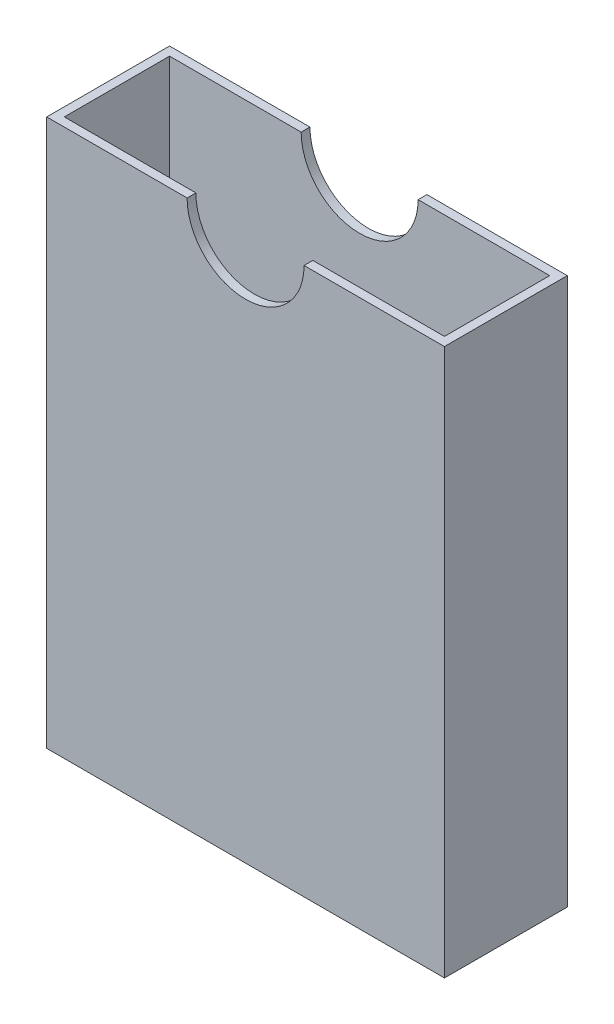
ISO-10303-21;
HEADER;
FILE_DESCRIPTION(('STEP AP214'),'2;1');
FILE_NAME('part.step','',(''),(''),'','','');
FILE_SCHEMA(('AUTOMOTIVE_DESIGN { 1 0 10303 214 1 1 1 1 }'));
ENDSEC;
DATA;
#1=APPLICATION_CONTEXT('core data for automotive mechanical design processes');
#2=APPLICATION_PROTOCOL_DEFINITION('international standard','automotive_design',2000,#1);
#3=PRODUCT_CONTEXT('',#1,'mechanical');
#4=PRODUCT('Part','Part','',(#3));
#5=PRODUCT_RELATED_PRODUCT_CATEGORY('part','',(#4));
#6=PRODUCT_DEFINITION_FORMATION('','',#4);
#7=PRODUCT_DEFINITION_CONTEXT('part definition',#1,'design');
#8=PRODUCT_DEFINITION('design','',#6,#7);
#9=PRODUCT_DEFINITION_SHAPE('','',#8);
#10=(LENGTH_UNIT() NAMED_UNIT(*) SI_UNIT(.MILLI.,.METRE.));
#11=(NAMED_UNIT(*) PLANE_ANGLE_UNIT() SI_UNIT($,.RADIAN.));
#12=(NAMED_UNIT(*) SI_UNIT($,.STERADIAN.) SOLID_ANGLE_UNIT());
#13=UNCERTAINTY_MEASURE_WITH_UNIT(LENGTH_MEASURE(1.E-05),#10,'distance_accuracy_value','');
#14=(GEOMETRIC_REPRESENTATION_CONTEXT(3) GLOBAL_UNCERTAINTY_ASSIGNED_CONTEXT((#13)) GLOBAL_UNIT_ASSIGNED_CONTEXT((#10,
#11,#12)) REPRESENTATION_CONTEXT('',''));
#15=CARTESIAN_POINT('',(0.,0.,0.));
#16=DIRECTION('',(0.,0.,1.));
#17=DIRECTION('',(1.,0.,0.));
#18=AXIS2_PLACEMENT_3D('',#15,#16,#17);
#19=CARTESIAN_POINT('',(0.,93.5,0.));
#20=DIRECTION('',(0.,1.,0.));
#21=DIRECTION('',(0.,0.,1.));
#22=AXIS2_PLACEMENT_3D('',#19,#20,#21);
#23=PLANE('',#22);
#24=DIRECTION('',(0.,0.,1.));
#25=VECTOR('',#24,1.);
#26=CARTESIAN_POINT('',(-10.,93.5,-32.8606797749979));
#27=LINE('',#26,#25);
#28=CARTESIAN_POINT('',(-10.,93.5,-10.5));
#29=VERTEX_POINT('',#28);
#30=CARTESIAN_POINT('',(-10.,93.5,-9.));
#31=VERTEX_POINT('',#30);
#32=EDGE_CURVE('E57',#29,#31,#27,.T.);
#33=ORIENTED_EDGE('',*,*,#32,.F.);
#34=DIRECTION('',(-1.,0.,0.));
#35=VECTOR('',#34,1.);
#36=CARTESIAN_POINT('',(34.,93.5,-10.5));
#37=LINE('',#36,#35);
#38=CARTESIAN_POINT('',(-34.,93.5,-10.5));
#39=VERTEX_POINT('',#38);
#40=EDGE_CURVE('E137',#29,#39,#37,.T.);
#41=ORIENTED_EDGE('',*,*,#40,.T.);
#42=DIRECTION('',(0.,0.,1.));
#43=VECTOR('',#42,1.);
#44=CARTESIAN_POINT('',(-34.,93.5,-10.5));
#45=LINE('',#44,#43);
#46=CARTESIAN_POINT('',(-34.,93.5,10.5));
#47=VERTEX_POINT('',#46);
#48=EDGE_CURVE('E187',#39,#47,#45,.T.);
#49=ORIENTED_EDGE('',*,*,#48,.T.);
#50=DIRECTION('',(1.,0.,0.));
#51=VECTOR('',#50,1.);
#52=CARTESIAN_POINT('',(-34.,93.5,10.5));
#53=LINE('',#52,#51);
#54=CARTESIAN_POINT('',(-10.,93.5,10.5));
#55=VERTEX_POINT('',#54);
#56=EDGE_CURVE('E182',#47,#55,#53,.T.);
#57=ORIENTED_EDGE('',*,*,#56,.T.);
#58=CARTESIAN_POINT('',(-10.,93.5,9.));
#59=VERTEX_POINT('',#58);
#60=EDGE_CURVE('E129',#59,#55,#27,.T.);
#61=ORIENTED_EDGE('',*,*,#60,.F.);
#62=DIRECTION('',(1.,0.,0.));
#63=VECTOR('',#62,1.);
#64=CARTESIAN_POINT('',(-32.5,93.5,9.));
#65=LINE('',#64,#63);
#66=CARTESIAN_POINT('',(-32.5,93.5,9.));
#67=VERTEX_POINT('',#66);
#68=EDGE_CURVE('E218',#67,#59,#65,.T.);
#69=ORIENTED_EDGE('',*,*,#68,.F.);
#70=DIRECTION('',(0.,0.,1.));
#71=VECTOR('',#70,1.);
#72=CARTESIAN_POINT('',(-32.5,93.5,-9.));
#73=LINE('',#72,#71);
#74=CARTESIAN_POINT('',(-32.5,93.5,-9.));
#75=VERTEX_POINT('',#74);
#76=EDGE_CURVE('E205',#75,#67,#73,.T.);
#77=ORIENTED_EDGE('',*,*,#76,.F.);
#78=DIRECTION('',(-1.,0.,0.));
#79=VECTOR('',#78,1.);
#80=CARTESIAN_POINT('',(32.5,93.5,-9.));
#81=LINE('',#80,#79);
#82=EDGE_CURVE('E214',#31,#75,#81,.T.);
#83=ORIENTED_EDGE('',*,*,#82,.F.);
#84=EDGE_LOOP('',(#33,#41,#49,#57,#61,#69,#77,#83));
#85=FACE_BOUND('',#84,.T.);
#86=ADVANCED_FACE('F35',(#85),#23,.T.);
#87=CARTESIAN_POINT('',(34.,1.5,0.));
#88=DIRECTION('',(1.,0.,0.));
#89=DIRECTION('',(0.,0.,-1.));
#90=AXIS2_PLACEMENT_3D('',#87,#88,#89);
#91=PLANE('',#90);
#92=DIRECTION('',(0.,0.,1.));
#93=VECTOR('',#92,1.);
#94=CARTESIAN_POINT('',(34.,0.,0.));
#95=LINE('',#94,#93);
#96=CARTESIAN_POINT('',(34.,0.,-10.5));
#97=VERTEX_POINT('',#96);
#98=CARTESIAN_POINT('',(34.,0.,10.5));
#99=VERTEX_POINT('',#98);
#100=EDGE_CURVE('E144',#97,#99,#95,.T.);
#101=ORIENTED_EDGE('',*,*,#100,.F.);
#102=DIRECTION('',(0.,-1.,0.));
#103=VECTOR('',#102,1.);
#104=CARTESIAN_POINT('',(34.,1.5,-10.5));
#105=LINE('',#104,#103);
#106=CARTESIAN_POINT('',(34.,93.5,-10.5));
#107=VERTEX_POINT('',#106);
#108=EDGE_CURVE('E43',#107,#97,#105,.T.);
#109=ORIENTED_EDGE('',*,*,#108,.F.);
#110=DIRECTION('',(0.,0.,-1.));
#111=VECTOR('',#110,1.);
#112=CARTESIAN_POINT('',(34.,93.5,10.5));
#113=LINE('',#112,#111);
#114=CARTESIAN_POINT('',(34.,93.5,10.5));
#115=VERTEX_POINT('',#114);
#116=EDGE_CURVE('E143',#115,#107,#113,.T.);
#117=ORIENTED_EDGE('',*,*,#116,.F.);
#118=DIRECTION('',(0.,-1.,0.));
#119=VECTOR('',#118,1.);
#120=CARTESIAN_POINT('',(34.,1.5,10.5));
#121=LINE('',#120,#119);
#122=EDGE_CURVE('E159',#115,#99,#121,.T.);
#123=ORIENTED_EDGE('',*,*,#122,.T.);
#124=EDGE_LOOP('',(#101,#109,#117,#123));
#125=FACE_BOUND('',#124,.T.);
#126=ADVANCED_FACE('F37',(#125),#91,.T.);
#127=CARTESIAN_POINT('',(0.,1.5,-10.5));
#128=DIRECTION('',(0.,0.,-1.));
#129=DIRECTION('',(-1.,0.,0.));
#130=AXIS2_PLACEMENT_3D('',#127,#128,#129);
#131=PLANE('',#130);
#132=CARTESIAN_POINT('',(0.,93.5,-10.5));
#133=DIRECTION('',(0.,0.,-1.));
#134=DIRECTION('',(-1.,0.,0.));
#135=AXIS2_PLACEMENT_3D('',#132,#133,#134);
#136=CIRCLE('',#135,10.);
#137=CARTESIAN_POINT('',(9.99999999999999,93.5,-10.5));
#138=VERTEX_POINT('',#137);
#139=EDGE_CURVE('E124',#29,#138,#136,.F.);
#140=ORIENTED_EDGE('',*,*,#139,.T.);
#141=EDGE_CURVE('E135',#107,#138,#37,.T.);
#142=ORIENTED_EDGE('',*,*,#141,.F.);
#143=ORIENTED_EDGE('',*,*,#108,.T.);
#144=DIRECTION('',(1.,0.,0.));
#145=VECTOR('',#144,1.);
#146=CARTESIAN_POINT('',(0.,0.,-10.5));
#147=LINE('',#146,#145);
#148=CARTESIAN_POINT('',(-34.,0.,-10.5));
#149=VERTEX_POINT('',#148);
#150=EDGE_CURVE('E147',#149,#97,#147,.T.);
#151=ORIENTED_EDGE('',*,*,#150,.F.);
#152=DIRECTION('',(0.,-1.,0.));
#153=VECTOR('',#152,1.);
#154=CARTESIAN_POINT('',(-34.,1.5,-10.5));
#155=LINE('',#154,#153);
#156=EDGE_CURVE('E164',#39,#149,#155,.T.);
#157=ORIENTED_EDGE('',*,*,#156,.F.);
#158=ORIENTED_EDGE('',*,*,#40,.F.);
#159=EDGE_LOOP('',(#140,#142,#143,#151,#157,#158));
#160=FACE_BOUND('',#159,.T.);
#161=ADVANCED_FACE('F134',(#160),#131,.T.);
#162=CARTESIAN_POINT('',(-34.,1.5,0.));
#163=DIRECTION('',(1.,0.,0.));
#164=DIRECTION('',(0.,0.,-1.));
#165=AXIS2_PLACEMENT_3D('',#162,#163,#164);
#166=PLANE('',#165);
#167=DIRECTION('',(0.,0.,1.));
#168=VECTOR('',#167,1.);
#169=CARTESIAN_POINT('',(-34.,0.,0.));
#170=LINE('',#169,#168);
#171=CARTESIAN_POINT('',(-34.,0.,10.5));
#172=VERTEX_POINT('',#171);
#173=EDGE_CURVE('E154',#149,#172,#170,.T.);
#174=ORIENTED_EDGE('',*,*,#173,.T.);
#175=DIRECTION('',(0.,-1.,0.));
#176=VECTOR('',#175,1.);
#177=CARTESIAN_POINT('',(-34.,1.5,10.5));
#178=LINE('',#177,#176);
#179=EDGE_CURVE('E161',#47,#172,#178,.T.);
#180=ORIENTED_EDGE('',*,*,#179,.F.);
#181=ORIENTED_EDGE('',*,*,#48,.F.);
#182=ORIENTED_EDGE('',*,*,#156,.T.);
#183=EDGE_LOOP('',(#174,#180,#181,#182));
#184=FACE_BOUND('',#183,.T.);
#185=ADVANCED_FACE('F174',(#184),#166,.F.);
#186=CARTESIAN_POINT('',(0.,1.5,10.5));
#187=DIRECTION('',(0.,0.,-1.));
#188=DIRECTION('',(-1.,0.,0.));
#189=AXIS2_PLACEMENT_3D('',#186,#187,#188);
#190=PLANE('',#189);
#191=CARTESIAN_POINT('',(9.99999999999999,93.5,10.5));
#192=VERTEX_POINT('',#191);
#193=EDGE_CURVE('E186',#192,#115,#53,.T.);
#194=ORIENTED_EDGE('',*,*,#193,.F.);
#195=CARTESIAN_POINT('',(0.,93.5,10.5));
#196=DIRECTION('',(0.,0.,1.));
#197=DIRECTION('',(1.,0.,0.));
#198=AXIS2_PLACEMENT_3D('',#195,#196,#197);
#199=CIRCLE('',#198,10.);
#200=EDGE_CURVE('E138',#55,#192,#199,.T.);
#201=ORIENTED_EDGE('',*,*,#200,.F.);
#202=ORIENTED_EDGE('',*,*,#56,.F.);
#203=ORIENTED_EDGE('',*,*,#179,.T.);
#204=DIRECTION('',(1.,0.,0.));
#205=VECTOR('',#204,1.);
#206=CARTESIAN_POINT('',(0.,0.,10.5));
#207=LINE('',#206,#205);
#208=EDGE_CURVE('E156',#172,#99,#207,.T.);
#209=ORIENTED_EDGE('',*,*,#208,.T.);
#210=ORIENTED_EDGE('',*,*,#122,.F.);
#211=EDGE_LOOP('',(#194,#201,#202,#203,#209,#210));
#212=FACE_BOUND('',#211,.T.);
#213=ADVANCED_FACE('F179',(#212),#190,.F.);
#214=CARTESIAN_POINT('',(0.,0.,0.));
#215=DIRECTION('',(0.,1.,0.));
#216=DIRECTION('',(0.,0.,1.));
#217=AXIS2_PLACEMENT_3D('',#214,#215,#216);
#218=PLANE('',#217);
#219=ORIENTED_EDGE('',*,*,#100,.T.);
#220=ORIENTED_EDGE('',*,*,#208,.F.);
#221=ORIENTED_EDGE('',*,*,#173,.F.);
#222=ORIENTED_EDGE('',*,*,#150,.T.);
#223=EDGE_LOOP('',(#219,#220,#221,#222));
#224=FACE_BOUND('',#223,.T.);
#225=ADVANCED_FACE('F172',(#224),#218,.F.);
#226=DIRECTION('',(0.,0.,1.));
#227=VECTOR('',#226,1.);
#228=CARTESIAN_POINT('',(9.99999999999999,93.5,-32.8606797749979));
#229=LINE('',#228,#227);
#230=CARTESIAN_POINT('',(9.99999999999999,93.5,9.));
#231=VERTEX_POINT('',#230);
#232=EDGE_CURVE('E50',#231,#192,#229,.T.);
#233=ORIENTED_EDGE('',*,*,#232,.T.);
#234=ORIENTED_EDGE('',*,*,#193,.T.);
#235=ORIENTED_EDGE('',*,*,#116,.T.);
#236=ORIENTED_EDGE('',*,*,#141,.T.);
#237=CARTESIAN_POINT('',(9.99999999999999,93.5,-9.));
#238=VERTEX_POINT('',#237);
#239=EDGE_CURVE('E121',#138,#238,#229,.T.);
#240=ORIENTED_EDGE('',*,*,#239,.T.);
#241=CARTESIAN_POINT('',(32.5,93.5,-9.));
#242=VERTEX_POINT('',#241);
#243=EDGE_CURVE('E202',#242,#238,#81,.T.);
#244=ORIENTED_EDGE('',*,*,#243,.F.);
#245=DIRECTION('',(0.,0.,-1.));
#246=VECTOR('',#245,1.);
#247=CARTESIAN_POINT('',(32.5,93.5,9.));
#248=LINE('',#247,#246);
#249=CARTESIAN_POINT('',(32.5,93.5,9.));
#250=VERTEX_POINT('',#249);
#251=EDGE_CURVE('E215',#250,#242,#248,.T.);
#252=ORIENTED_EDGE('',*,*,#251,.F.);
#253=EDGE_CURVE('E221',#231,#250,#65,.T.);
#254=ORIENTED_EDGE('',*,*,#253,.F.);
#255=EDGE_LOOP('',(#233,#234,#235,#236,#240,#244,#252,#254));
#256=FACE_BOUND('',#255,.T.);
#257=ADVANCED_FACE('F141',(#256),#23,.T.);
#258=CARTESIAN_POINT('',(-32.5,93.5,-9.));
#259=DIRECTION('',(1.,0.,0.));
#260=DIRECTION('',(0.,0.,-1.));
#261=AXIS2_PLACEMENT_3D('',#258,#259,#260);
#262=PLANE('',#261);
#263=DIRECTION('',(0.,0.,1.));
#264=VECTOR('',#263,1.);
#265=CARTESIAN_POINT('',(-32.5,1.5,-9.));
#266=LINE('',#265,#264);
#267=CARTESIAN_POINT('',(-32.5,1.5,-9.));
#268=VERTEX_POINT('',#267);
#269=CARTESIAN_POINT('',(-32.5,1.5,9.));
#270=VERTEX_POINT('',#269);
#271=EDGE_CURVE('E210',#268,#270,#266,.T.);
#272=ORIENTED_EDGE('',*,*,#271,.F.);
#273=DIRECTION('',(0.,-1.,0.));
#274=VECTOR('',#273,1.);
#275=CARTESIAN_POINT('',(-32.5,93.5,-9.));
#276=LINE('',#275,#274);
#277=EDGE_CURVE('E199',#75,#268,#276,.T.);
#278=ORIENTED_EDGE('',*,*,#277,.F.);
#279=ORIENTED_EDGE('',*,*,#76,.T.);
#280=DIRECTION('',(0.,-1.,0.));
#281=VECTOR('',#280,1.);
#282=CARTESIAN_POINT('',(-32.5,93.5,9.));
#283=LINE('',#282,#281);
#284=EDGE_CURVE('E188',#67,#270,#283,.T.);
#285=ORIENTED_EDGE('',*,*,#284,.T.);
#286=EDGE_LOOP('',(#272,#278,#279,#285));
#287=FACE_BOUND('',#286,.T.);
#288=ADVANCED_FACE('F242',(#287),#262,.T.);
#289=CARTESIAN_POINT('',(-32.5,93.5,9.));
#290=DIRECTION('',(0.,0.,-1.));
#291=DIRECTION('',(-1.,0.,0.));
#292=AXIS2_PLACEMENT_3D('',#289,#290,#291);
#293=PLANE('',#292);
#294=CARTESIAN_POINT('',(0.,93.5,9.));
#295=DIRECTION('',(0.,0.,-1.));
#296=DIRECTION('',(-1.,0.,0.));
#297=AXIS2_PLACEMENT_3D('',#294,#295,#296);
#298=CIRCLE('',#297,10.);
#299=EDGE_CURVE('E212',#231,#59,#298,.T.);
#300=ORIENTED_EDGE('',*,*,#299,.F.);
#301=ORIENTED_EDGE('',*,*,#253,.T.);
#302=DIRECTION('',(0.,-1.,0.));
#303=VECTOR('',#302,1.);
#304=CARTESIAN_POINT('',(32.5,93.5,9.));
#305=LINE('',#304,#303);
#306=CARTESIAN_POINT('',(32.5,1.5,9.));
#307=VERTEX_POINT('',#306);
#308=EDGE_CURVE('E191',#250,#307,#305,.T.);
#309=ORIENTED_EDGE('',*,*,#308,.T.);
#310=DIRECTION('',(1.,0.,0.));
#311=VECTOR('',#310,1.);
#312=CARTESIAN_POINT('',(-32.5,1.5,9.));
#313=LINE('',#312,#311);
#314=EDGE_CURVE('E208',#270,#307,#313,.T.);
#315=ORIENTED_EDGE('',*,*,#314,.F.);
#316=ORIENTED_EDGE('',*,*,#284,.F.);
#317=ORIENTED_EDGE('',*,*,#68,.T.);
#318=EDGE_LOOP('',(#300,#301,#309,#315,#316,#317));
#319=FACE_BOUND('',#318,.T.);
#320=ADVANCED_FACE('F230',(#319),#293,.T.);
#321=CARTESIAN_POINT('',(32.5,93.5,9.));
#322=DIRECTION('',(-1.,0.,0.));
#323=DIRECTION('',(0.,0.,1.));
#324=AXIS2_PLACEMENT_3D('',#321,#322,#323);
#325=PLANE('',#324);
#326=DIRECTION('',(0.,0.,-1.));
#327=VECTOR('',#326,1.);
#328=CARTESIAN_POINT('',(32.5,1.5,9.));
#329=LINE('',#328,#327);
#330=CARTESIAN_POINT('',(32.5,1.5,-9.));
#331=VERTEX_POINT('',#330);
#332=EDGE_CURVE('E206',#307,#331,#329,.T.);
#333=ORIENTED_EDGE('',*,*,#332,.F.);
#334=ORIENTED_EDGE('',*,*,#308,.F.);
#335=ORIENTED_EDGE('',*,*,#251,.T.);
#336=DIRECTION('',(0.,-1.,0.));
#337=VECTOR('',#336,1.);
#338=CARTESIAN_POINT('',(32.5,93.5,-9.));
#339=LINE('',#338,#337);
#340=EDGE_CURVE('E196',#242,#331,#339,.T.);
#341=ORIENTED_EDGE('',*,*,#340,.T.);
#342=EDGE_LOOP('',(#333,#334,#335,#341));
#343=FACE_BOUND('',#342,.T.);
#344=ADVANCED_FACE('F234',(#343),#325,.T.);
#345=CARTESIAN_POINT('',(32.5,93.5,-9.));
#346=DIRECTION('',(0.,0.,1.));
#347=DIRECTION('',(1.,0.,0.));
#348=AXIS2_PLACEMENT_3D('',#345,#346,#347);
#349=PLANE('',#348);
#350=CARTESIAN_POINT('',(0.,93.5,-9.));
#351=DIRECTION('',(0.,0.,1.));
#352=DIRECTION('',(1.,0.,0.));
#353=AXIS2_PLACEMENT_3D('',#350,#351,#352);
#354=CIRCLE('',#353,10.);
#355=EDGE_CURVE('E11',#31,#238,#354,.T.);
#356=ORIENTED_EDGE('',*,*,#355,.F.);
#357=ORIENTED_EDGE('',*,*,#82,.T.);
#358=ORIENTED_EDGE('',*,*,#277,.T.);
#359=DIRECTION('',(-1.,0.,0.));
#360=VECTOR('',#359,1.);
#361=CARTESIAN_POINT('',(32.5,1.5,-9.));
#362=LINE('',#361,#360);
#363=EDGE_CURVE('E203',#331,#268,#362,.T.);
#364=ORIENTED_EDGE('',*,*,#363,.F.);
#365=ORIENTED_EDGE('',*,*,#340,.F.);
#366=ORIENTED_EDGE('',*,*,#243,.T.);
#367=EDGE_LOOP('',(#356,#357,#358,#364,#365,#366));
#368=FACE_BOUND('',#367,.T.);
#369=ADVANCED_FACE('F247',(#368),#349,.T.);
#370=CARTESIAN_POINT('',(0.,1.5,0.));
#371=DIRECTION('',(0.,1.,0.));
#372=DIRECTION('',(0.,0.,1.));
#373=AXIS2_PLACEMENT_3D('',#370,#371,#372);
#374=PLANE('',#373);
#375=ORIENTED_EDGE('',*,*,#271,.T.);
#376=ORIENTED_EDGE('',*,*,#314,.T.);
#377=ORIENTED_EDGE('',*,*,#332,.T.);
#378=ORIENTED_EDGE('',*,*,#363,.T.);
#379=EDGE_LOOP('',(#375,#376,#377,#378));
#380=FACE_BOUND('',#379,.T.);
#381=ADVANCED_FACE('F237',(#380),#374,.T.);
#382=CARTESIAN_POINT('',(0.,93.5,-32.8606797749979));
#383=DIRECTION('',(0.,0.,1.));
#384=DIRECTION('',(1.,0.,0.));
#385=AXIS2_PLACEMENT_3D('',#382,#383,#384);
#386=CYLINDRICAL_SURFACE('',#385,10.);
#387=ORIENTED_EDGE('',*,*,#355,.T.);
#388=ORIENTED_EDGE('',*,*,#239,.F.);
#389=ORIENTED_EDGE('',*,*,#139,.F.);
#390=ORIENTED_EDGE('',*,*,#32,.T.);
#391=EDGE_LOOP('',(#387,#388,#389,#390));
#392=FACE_BOUND('',#391,.T.);
#393=ADVANCED_FACE('F123',(#392),#386,.F.);
#394=ORIENTED_EDGE('',*,*,#299,.T.);
#395=ORIENTED_EDGE('',*,*,#60,.T.);
#396=ORIENTED_EDGE('',*,*,#200,.T.);
#397=ORIENTED_EDGE('',*,*,#232,.F.);
#398=EDGE_LOOP('',(#394,#395,#396,#397));
#399=FACE_BOUND('',#398,.T.);
#400=ADVANCED_FACE('F225',(#399),#386,.F.);
#401=CLOSED_SHELL('',(#86,#126,#161,#185,#213,#225,#257,#288,#320,#344,#369,#381,#393,#400));
#402=MANIFOLD_SOLID_BREP('B2',#401);
#403=ADVANCED_BREP_SHAPE_REPRESENTATION('',(#18,#402),#14);
#404=SHAPE_DEFINITION_REPRESENTATION(#9,#403);
ENDSEC;
END-ISO-10303-21;
